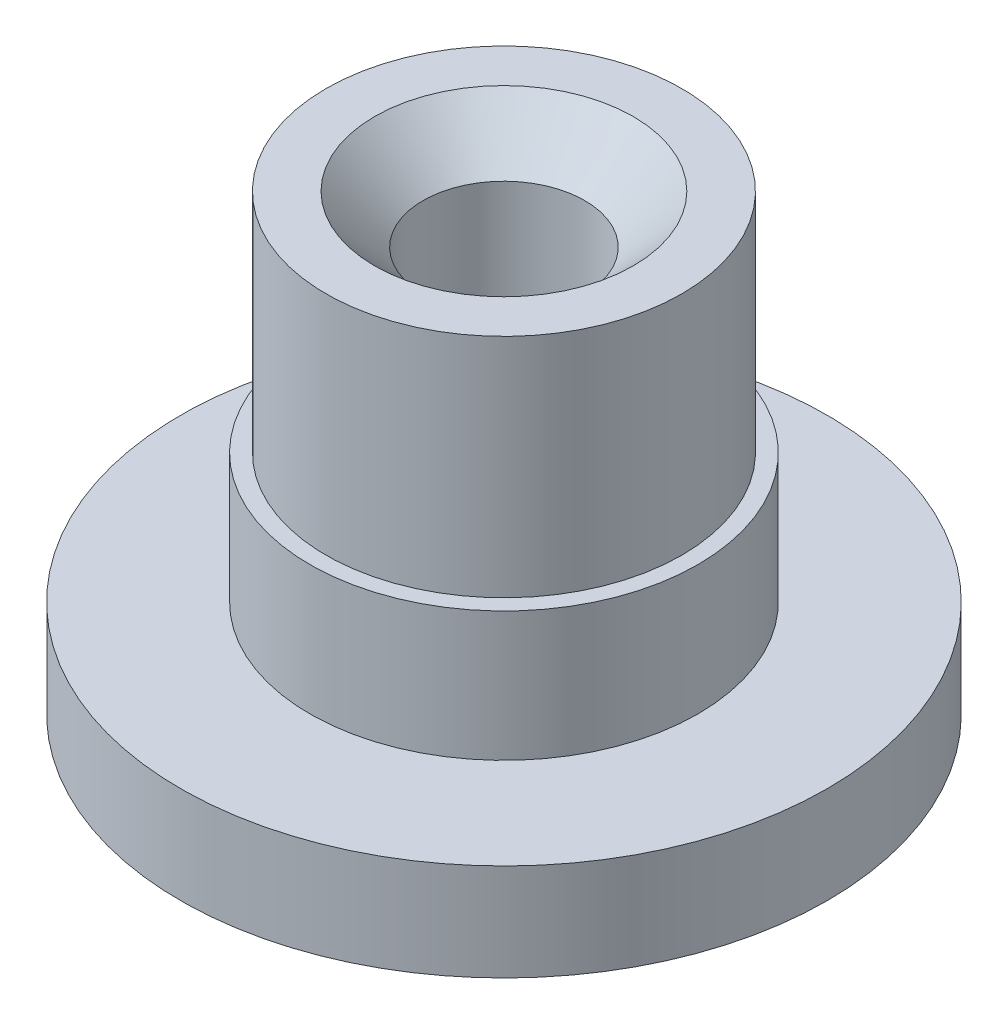
ISO-10303-21;
HEADER;
FILE_DESCRIPTION(('STEP AP214'),'2;1');
FILE_NAME('part.step','',(''),(''),'','','');
FILE_SCHEMA(('AUTOMOTIVE_DESIGN { 1 0 10303 214 1 1 1 1 }'));
ENDSEC;
DATA;
#1=APPLICATION_CONTEXT('core data for automotive mechanical design processes');
#2=APPLICATION_PROTOCOL_DEFINITION('international standard','automotive_design',2000,#1);
#3=PRODUCT_CONTEXT('',#1,'mechanical');
#4=PRODUCT('Part','Part','',(#3));
#5=PRODUCT_RELATED_PRODUCT_CATEGORY('part','',(#4));
#6=PRODUCT_DEFINITION_FORMATION('','',#4);
#7=PRODUCT_DEFINITION_CONTEXT('part definition',#1,'design');
#8=PRODUCT_DEFINITION('design','',#6,#7);
#9=PRODUCT_DEFINITION_SHAPE('','',#8);
#10=(LENGTH_UNIT() NAMED_UNIT(*) SI_UNIT(.MILLI.,.METRE.));
#11=(NAMED_UNIT(*) PLANE_ANGLE_UNIT() SI_UNIT($,.RADIAN.));
#12=(NAMED_UNIT(*) SI_UNIT($,.STERADIAN.) SOLID_ANGLE_UNIT());
#13=UNCERTAINTY_MEASURE_WITH_UNIT(LENGTH_MEASURE(1.E-05),#10,'distance_accuracy_value','');
#14=(GEOMETRIC_REPRESENTATION_CONTEXT(3) GLOBAL_UNCERTAINTY_ASSIGNED_CONTEXT((#13)) GLOBAL_UNIT_ASSIGNED_CONTEXT((#10,
#11,#12)) REPRESENTATION_CONTEXT('',''));
#15=CARTESIAN_POINT('',(0.,0.,0.));
#16=DIRECTION('',(0.,0.,1.));
#17=DIRECTION('',(1.,0.,0.));
#18=AXIS2_PLACEMENT_3D('',#15,#16,#17);
#19=CARTESIAN_POINT('',(2.5,0.,0.));
#20=DIRECTION('',(0.,-1.,0.));
#21=DIRECTION('',(1.,0.,0.));
#22=AXIS2_PLACEMENT_3D('',#19,#20,#21);
#23=PLANE('',#22);
#24=CARTESIAN_POINT('',(0.,0.,0.));
#25=DIRECTION('',(0.,-1.,0.));
#26=DIRECTION('',(1.,0.,0.));
#27=AXIS2_PLACEMENT_3D('',#24,#25,#26);
#28=CIRCLE('',#27,10.);
#29=CARTESIAN_POINT('',(10.,0.,0.));
#30=VERTEX_POINT('',#29);
#31=EDGE_CURVE('E10',#30,#30,#28,.T.);
#32=ORIENTED_EDGE('',*,*,#31,.T.);
#33=EDGE_LOOP('',(#32));
#34=FACE_BOUND('',#33,.T.);
#35=CARTESIAN_POINT('',(0.,0.,0.));
#36=DIRECTION('',(0.,-1.,0.));
#37=DIRECTION('',(1.,0.,0.));
#38=AXIS2_PLACEMENT_3D('',#35,#36,#37);
#39=CIRCLE('',#38,2.5);
#40=CARTESIAN_POINT('',(2.5,0.,0.));
#41=VERTEX_POINT('',#40);
#42=EDGE_CURVE('E76',#41,#41,#39,.T.);
#43=ORIENTED_EDGE('',*,*,#42,.F.);
#44=EDGE_LOOP('',(#43));
#45=FACE_BOUND('',#44,.T.);
#46=ADVANCED_FACE('F37',(#34,#45),#23,.T.);
#47=CARTESIAN_POINT('',(3.43024899888577E-12,-1000.,0.));
#48=DIRECTION('',(0.,-1.,0.));
#49=DIRECTION('',(1.,0.,0.));
#50=AXIS2_PLACEMENT_3D('',#47,#48,#49);
#51=CYLINDRICAL_SURFACE('',#50,10.);
#52=CARTESIAN_POINT('',(0.,3.00000000000011,0.));
#53=DIRECTION('',(0.,-1.,0.));
#54=DIRECTION('',(1.,0.,0.));
#55=AXIS2_PLACEMENT_3D('',#52,#53,#54);
#56=CIRCLE('',#55,10.);
#57=CARTESIAN_POINT('',(10.,3.00000000000015,0.));
#58=VERTEX_POINT('',#57);
#59=EDGE_CURVE('E44',#58,#58,#56,.T.);
#60=ORIENTED_EDGE('',*,*,#59,.T.);
#61=EDGE_LOOP('',(#60));
#62=FACE_BOUND('',#61,.T.);
#63=ORIENTED_EDGE('',*,*,#31,.F.);
#64=EDGE_LOOP('',(#63));
#65=FACE_BOUND('',#64,.T.);
#66=ADVANCED_FACE('F85',(#62,#65),#51,.T.);
#67=CARTESIAN_POINT('',(10.,3.00000000000001,0.));
#68=DIRECTION('',(0.,1.,0.));
#69=DIRECTION('',(-1.,0.,0.));
#70=AXIS2_PLACEMENT_3D('',#67,#68,#69);
#71=PLANE('',#70);
#72=CARTESIAN_POINT('',(0.,3.00000000000011,0.));
#73=DIRECTION('',(0.,-1.,0.));
#74=DIRECTION('',(1.,0.,0.));
#75=AXIS2_PLACEMENT_3D('',#72,#73,#74);
#76=CIRCLE('',#75,6.00000000000007);
#77=CARTESIAN_POINT('',(6.00000000000006,3.00000000000013,0.));
#78=VERTEX_POINT('',#77);
#79=EDGE_CURVE('E49',#78,#78,#76,.T.);
#80=ORIENTED_EDGE('',*,*,#79,.T.);
#81=EDGE_LOOP('',(#80));
#82=FACE_BOUND('',#81,.T.);
#83=ORIENTED_EDGE('',*,*,#59,.F.);
#84=EDGE_LOOP('',(#83));
#85=FACE_BOUND('',#84,.T.);
#86=ADVANCED_FACE('F89',(#82,#85),#71,.T.);
#87=CARTESIAN_POINT('',(3.43024899888577E-12,-1000.,0.));
#88=DIRECTION('',(0.,-1.,0.));
#89=DIRECTION('',(1.,0.,0.));
#90=AXIS2_PLACEMENT_3D('',#87,#88,#89);
#91=CYLINDRICAL_SURFACE('',#90,6.00000000000008);
#92=CARTESIAN_POINT('',(0.,6.9999999999999,0.));
#93=DIRECTION('',(0.,-1.,0.));
#94=DIRECTION('',(1.,0.,0.));
#95=AXIS2_PLACEMENT_3D('',#92,#93,#94);
#96=CIRCLE('',#95,6.00000000000009);
#97=CARTESIAN_POINT('',(6.00000000000006,6.99999999999992,0.));
#98=VERTEX_POINT('',#97);
#99=EDGE_CURVE('E54',#98,#98,#96,.T.);
#100=ORIENTED_EDGE('',*,*,#99,.T.);
#101=EDGE_LOOP('',(#100));
#102=FACE_BOUND('',#101,.T.);
#103=ORIENTED_EDGE('',*,*,#79,.F.);
#104=EDGE_LOOP('',(#103));
#105=FACE_BOUND('',#104,.T.);
#106=ADVANCED_FACE('F93',(#102,#105),#91,.T.);
#107=CARTESIAN_POINT('',(6.00000000000006,7.,0.));
#108=DIRECTION('',(0.,1.,0.));
#109=DIRECTION('',(-1.,0.,0.));
#110=AXIS2_PLACEMENT_3D('',#107,#108,#109);
#111=PLANE('',#110);
#112=CARTESIAN_POINT('',(0.,6.9999999999999,0.));
#113=DIRECTION('',(0.,-1.,0.));
#114=DIRECTION('',(1.,0.,0.));
#115=AXIS2_PLACEMENT_3D('',#112,#113,#114);
#116=CIRCLE('',#115,5.50000000000002);
#117=CARTESIAN_POINT('',(5.5,6.99999999999991,0.));
#118=VERTEX_POINT('',#117);
#119=EDGE_CURVE('E60',#118,#118,#116,.T.);
#120=ORIENTED_EDGE('',*,*,#119,.T.);
#121=EDGE_LOOP('',(#120));
#122=FACE_BOUND('',#121,.T.);
#123=ORIENTED_EDGE('',*,*,#99,.F.);
#124=EDGE_LOOP('',(#123));
#125=FACE_BOUND('',#124,.T.);
#126=ADVANCED_FACE('F100',(#122,#125),#111,.T.);
#127=CARTESIAN_POINT('',(3.43024899888577E-12,-1000.,0.));
#128=DIRECTION('',(0.,-1.,0.));
#129=DIRECTION('',(1.,0.,0.));
#130=AXIS2_PLACEMENT_3D('',#127,#128,#129);
#131=CYLINDRICAL_SURFACE('',#130,5.50000000000004);
#132=CARTESIAN_POINT('',(0.,14.,0.));
#133=DIRECTION('',(0.,-1.,0.));
#134=DIRECTION('',(1.,0.,0.));
#135=AXIS2_PLACEMENT_3D('',#132,#133,#134);
#136=CIRCLE('',#135,5.50000000000005);
#137=CARTESIAN_POINT('',(5.5,14.,0.));
#138=VERTEX_POINT('',#137);
#139=EDGE_CURVE('E64',#138,#138,#136,.T.);
#140=ORIENTED_EDGE('',*,*,#139,.T.);
#141=EDGE_LOOP('',(#140));
#142=FACE_BOUND('',#141,.T.);
#143=ORIENTED_EDGE('',*,*,#119,.F.);
#144=EDGE_LOOP('',(#143));
#145=FACE_BOUND('',#144,.T.);
#146=ADVANCED_FACE('F104',(#142,#145),#131,.T.);
#147=CARTESIAN_POINT('',(5.5,14.,0.));
#148=DIRECTION('',(0.,1.,0.));
#149=DIRECTION('',(-1.,0.,0.));
#150=AXIS2_PLACEMENT_3D('',#147,#148,#149);
#151=PLANE('',#150);
#152=CARTESIAN_POINT('',(0.,14.,0.));
#153=DIRECTION('',(0.,-1.,0.));
#154=DIRECTION('',(1.,0.,0.));
#155=AXIS2_PLACEMENT_3D('',#152,#153,#154);
#156=CIRCLE('',#155,4.00000000000005);
#157=CARTESIAN_POINT('',(4.,14.,0.));
#158=VERTEX_POINT('',#157);
#159=EDGE_CURVE('E68',#158,#158,#156,.T.);
#160=ORIENTED_EDGE('',*,*,#159,.T.);
#161=EDGE_LOOP('',(#160));
#162=FACE_BOUND('',#161,.T.);
#163=ORIENTED_EDGE('',*,*,#139,.F.);
#164=EDGE_LOOP('',(#163));
#165=FACE_BOUND('',#164,.T.);
#166=ADVANCED_FACE('F108',(#162,#165),#151,.T.);
#167=CARTESIAN_POINT('',(0.,14.,0.));
#168=DIRECTION('',(0.,1.,0.));
#169=DIRECTION('',(-1.,0.,0.));
#170=AXIS2_PLACEMENT_3D('',#167,#168,#169);
#171=CONICAL_SURFACE('',#170,4.00000000000005,0.785398163397431);
#172=CARTESIAN_POINT('',(0.,12.5,0.));
#173=DIRECTION('',(0.,-1.,0.));
#174=DIRECTION('',(1.,0.,0.));
#175=AXIS2_PLACEMENT_3D('',#172,#173,#174);
#176=CIRCLE('',#175,2.50000000000004);
#177=CARTESIAN_POINT('',(2.5,12.5,0.));
#178=VERTEX_POINT('',#177);
#179=EDGE_CURVE('E72',#178,#178,#176,.T.);
#180=ORIENTED_EDGE('',*,*,#179,.T.);
#181=EDGE_LOOP('',(#180));
#182=FACE_BOUND('',#181,.T.);
#183=ORIENTED_EDGE('',*,*,#159,.F.);
#184=EDGE_LOOP('',(#183));
#185=FACE_BOUND('',#184,.T.);
#186=ADVANCED_FACE('F112',(#182,#185),#171,.F.);
#187=CARTESIAN_POINT('',(3.43024899888577E-12,-1000.,0.));
#188=DIRECTION('',(0.,-1.,0.));
#189=DIRECTION('',(1.,0.,0.));
#190=AXIS2_PLACEMENT_3D('',#187,#188,#189);
#191=CYLINDRICAL_SURFACE('',#190,2.50000000000002);
#192=ORIENTED_EDGE('',*,*,#42,.T.);
#193=EDGE_LOOP('',(#192));
#194=FACE_BOUND('',#193,.T.);
#195=ORIENTED_EDGE('',*,*,#179,.F.);
#196=EDGE_LOOP('',(#195));
#197=FACE_BOUND('',#196,.T.);
#198=ADVANCED_FACE('F81',(#194,#197),#191,.F.);
#199=CLOSED_SHELL('',(#46,#66,#86,#106,#126,#146,#166,#186,#198));
#200=MANIFOLD_SOLID_BREP('B2',#199);
#201=ADVANCED_BREP_SHAPE_REPRESENTATION('',(#18,#200),#14);
#202=SHAPE_DEFINITION_REPRESENTATION(#9,#201);
ENDSEC;
END-ISO-10303-21;
